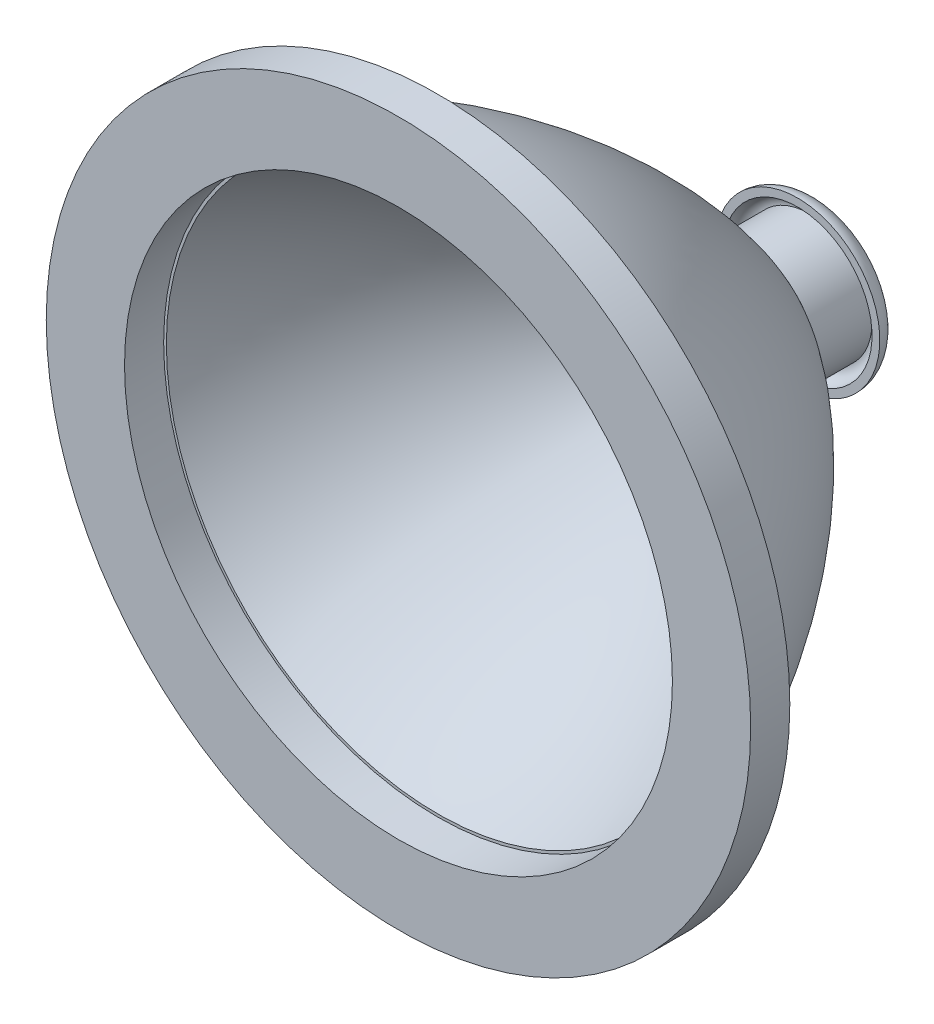
ISO-10303-21;
HEADER;
FILE_DESCRIPTION(('STEP AP214'),'2;1');
FILE_NAME('part.step','',(''),(''),'','','');
FILE_SCHEMA(('AUTOMOTIVE_DESIGN { 1 0 10303 214 1 1 1 1 }'));
ENDSEC;
DATA;
#1=APPLICATION_CONTEXT('core data for automotive mechanical design processes');
#2=APPLICATION_PROTOCOL_DEFINITION('international standard','automotive_design',2000,#1);
#3=PRODUCT_CONTEXT('',#1,'mechanical');
#4=PRODUCT('Part','Part','',(#3));
#5=PRODUCT_RELATED_PRODUCT_CATEGORY('part','',(#4));
#6=PRODUCT_DEFINITION_FORMATION('','',#4);
#7=PRODUCT_DEFINITION_CONTEXT('part definition',#1,'design');
#8=PRODUCT_DEFINITION('design','',#6,#7);
#9=PRODUCT_DEFINITION_SHAPE('','',#8);
#10=(LENGTH_UNIT() NAMED_UNIT(*) SI_UNIT(.MILLI.,.METRE.));
#11=(NAMED_UNIT(*) PLANE_ANGLE_UNIT() SI_UNIT($,.RADIAN.));
#12=(NAMED_UNIT(*) SI_UNIT($,.STERADIAN.) SOLID_ANGLE_UNIT());
#13=UNCERTAINTY_MEASURE_WITH_UNIT(LENGTH_MEASURE(1.E-05),#10,'distance_accuracy_value','');
#14=(GEOMETRIC_REPRESENTATION_CONTEXT(3) GLOBAL_UNCERTAINTY_ASSIGNED_CONTEXT((#13)) GLOBAL_UNIT_ASSIGNED_CONTEXT((#10,
#11,#12)) REPRESENTATION_CONTEXT('',''));
#15=CARTESIAN_POINT('',(0.,0.,0.));
#16=DIRECTION('',(0.,0.,1.));
#17=DIRECTION('',(1.,0.,0.));
#18=AXIS2_PLACEMENT_3D('',#15,#16,#17);
#19=CARTESIAN_POINT('',(0.,0.,0.));
#20=DIRECTION('',(0.,0.,-1.));
#21=DIRECTION('',(-1.,0.,0.));
#22=AXIS2_PLACEMENT_3D('',#19,#20,#21);
#23=PLANE('',#22);
#24=CARTESIAN_POINT('',(0.,0.,0.));
#25=DIRECTION('',(0.,0.,-1.));
#26=DIRECTION('',(-1.,0.,0.));
#27=AXIS2_PLACEMENT_3D('',#24,#25,#26);
#28=CIRCLE('',#27,44.0129431509694);
#29=CARTESIAN_POINT('',(-44.0129431509694,0.,0.));
#30=VERTEX_POINT('',#29);
#31=EDGE_CURVE('E57',#30,#30,#28,.F.);
#32=ORIENTED_EDGE('',*,*,#31,.F.);
#33=EDGE_LOOP('',(#32));
#34=FACE_BOUND('',#33,.T.);
#35=CARTESIAN_POINT('',(0.,0.,0.));
#36=DIRECTION('',(0.,0.,1.));
#37=DIRECTION('',(1.,0.,0.));
#38=AXIS2_PLACEMENT_3D('',#35,#36,#37);
#39=CIRCLE('',#38,44.45);
#40=CARTESIAN_POINT('',(44.45,0.,0.));
#41=VERTEX_POINT('',#40);
#42=EDGE_CURVE('E113',#41,#41,#39,.T.);
#43=ORIENTED_EDGE('',*,*,#42,.T.);
#44=EDGE_LOOP('',(#43));
#45=FACE_BOUND('',#44,.T.);
#46=ADVANCED_FACE('F45',(#34,#45),#23,.F.);
#47=CARTESIAN_POINT('',(0.,0.,-60.96));
#48=DIRECTION('',(0.,0.,1.));
#49=DIRECTION('',(1.,0.,0.));
#50=AXIS2_PLACEMENT_3D('',#47,#48,#49);
#51=CYLINDRICAL_SURFACE('',#50,10.16);
#52=CARTESIAN_POINT('',(0.,0.,-50.8));
#53=DIRECTION('',(0.,0.,-1.));
#54=DIRECTION('',(-1.,0.,0.));
#55=AXIS2_PLACEMENT_3D('',#52,#53,#54);
#56=CIRCLE('',#55,10.16);
#57=CARTESIAN_POINT('',(-10.16,0.,-50.8));
#58=VERTEX_POINT('',#57);
#59=EDGE_CURVE('E68',#58,#58,#56,.T.);
#60=ORIENTED_EDGE('',*,*,#59,.T.);
#61=EDGE_LOOP('',(#60));
#62=FACE_BOUND('',#61,.T.);
#63=CARTESIAN_POINT('',(0.,0.,-60.325));
#64=DIRECTION('',(0.,0.,1.));
#65=DIRECTION('',(1.,0.,0.));
#66=AXIS2_PLACEMENT_3D('',#63,#64,#65);
#67=CIRCLE('',#66,10.16);
#68=CARTESIAN_POINT('',(10.16,0.,-60.325));
#69=VERTEX_POINT('',#68);
#70=EDGE_CURVE('E10',#69,#69,#67,.F.);
#71=ORIENTED_EDGE('',*,*,#70,.F.);
#72=EDGE_LOOP('',(#71));
#73=FACE_BOUND('',#72,.T.);
#74=ADVANCED_FACE('F141',(#62,#73),#51,.T.);
#75=CARTESIAN_POINT('',(0.,0.,34.7283102836008));
#76=DIRECTION('',(0.,0.,1.));
#77=DIRECTION('',(1.,0.,0.));
#78=AXIS2_PLACEMENT_3D('',#75,#76,#77);
#79=DEGENERATE_TOROIDAL_SURFACE('',#78,44.680387854501,101.6,.F.);
#80=CARTESIAN_POINT('',(0.,0.,0.));
#81=DIRECTION('',(0.,0.,1.));
#82=DIRECTION('',(1.,0.,0.));
#83=AXIS2_PLACEMENT_3D('',#80,#81,#82);
#84=CIRCLE('',#83,50.8);
#85=CARTESIAN_POINT('',(50.8,0.,0.));
#86=VERTEX_POINT('',#85);
#87=EDGE_CURVE('E52',#86,#86,#84,.T.);
#88=ORIENTED_EDGE('',*,*,#87,.F.);
#89=EDGE_LOOP('',(#88));
#90=FACE_BOUND('',#89,.T.);
#91=ORIENTED_EDGE('',*,*,#59,.F.);
#92=EDGE_LOOP('',(#91));
#93=FACE_BOUND('',#92,.T.);
#94=ADVANCED_FACE('F147',(#90,#93),#79,.F.);
#95=CARTESIAN_POINT('',(0.,0.,34.7283102836008));
#96=DIRECTION('',(0.,0.,1.));
#97=DIRECTION('',(1.,0.,0.));
#98=AXIS2_PLACEMENT_3D('',#95,#96,#97);
#99=DEGENERATE_TOROIDAL_SURFACE('',#98,44.680387854501,95.25,.F.);
#100=ORIENTED_EDGE('',*,*,#31,.T.);
#101=EDGE_LOOP('',(#100));
#102=FACE_BOUND('',#101,.T.);
#103=CARTESIAN_POINT('',(0.,0.,-44.45));
#104=DIRECTION('',(0.,0.,1.));
#105=DIRECTION('',(1.,0.,0.));
#106=AXIS2_PLACEMENT_3D('',#103,#104,#105);
#107=CIRCLE('',#106,8.26635596071235);
#108=CARTESIAN_POINT('',(8.26635596071235,0.,-44.45));
#109=VERTEX_POINT('',#108);
#110=EDGE_CURVE('E62',#109,#109,#107,.T.);
#111=ORIENTED_EDGE('',*,*,#110,.F.);
#112=EDGE_LOOP('',(#111));
#113=FACE_BOUND('',#112,.T.);
#114=ADVANCED_FACE('F269',(#102,#113),#99,.T.);
#115=CARTESIAN_POINT('',(0.,0.,-44.45));
#116=DIRECTION('',(0.,0.,1.));
#117=DIRECTION('',(1.,0.,0.));
#118=AXIS2_PLACEMENT_3D('',#115,#116,#117);
#119=PLANE('',#118);
#120=CARTESIAN_POINT('',(0.,0.,-44.45));
#121=DIRECTION('',(0.,0.,1.));
#122=DIRECTION('',(1.,0.,0.));
#123=AXIS2_PLACEMENT_3D('',#120,#121,#122);
#124=CIRCLE('',#123,7.61999999999999);
#125=CARTESIAN_POINT('',(7.61999999999999,0.,-44.45));
#126=VERTEX_POINT('',#125);
#127=EDGE_CURVE('E84',#126,#126,#124,.T.);
#128=ORIENTED_EDGE('',*,*,#127,.F.);
#129=EDGE_LOOP('',(#128));
#130=FACE_BOUND('',#129,.T.);
#131=ORIENTED_EDGE('',*,*,#110,.T.);
#132=EDGE_LOOP('',(#131));
#133=FACE_BOUND('',#132,.T.);
#134=ADVANCED_FACE('F259',(#130,#133),#119,.T.);
#135=CARTESIAN_POINT('',(0.,0.,-60.96));
#136=DIRECTION('',(0.,0.,-1.));
#137=DIRECTION('',(-1.,0.,0.));
#138=AXIS2_PLACEMENT_3D('',#135,#136,#137);
#139=PLANE('',#138);
#140=CARTESIAN_POINT('',(0.,0.,-60.96));
#141=DIRECTION('',(0.,0.,1.));
#142=DIRECTION('',(1.,0.,0.));
#143=AXIS2_PLACEMENT_3D('',#140,#141,#142);
#144=CIRCLE('',#143,6.94563);
#145=CARTESIAN_POINT('',(6.94563,0.,-60.96));
#146=VERTEX_POINT('',#145);
#147=EDGE_CURVE('E72',#146,#146,#144,.T.);
#148=ORIENTED_EDGE('',*,*,#147,.T.);
#149=EDGE_LOOP('',(#148));
#150=FACE_BOUND('',#149,.T.);
#151=CARTESIAN_POINT('',(0.,0.,-60.96));
#152=DIRECTION('',(0.,0.,-1.));
#153=DIRECTION('',(-1.,0.,0.));
#154=AXIS2_PLACEMENT_3D('',#151,#152,#153);
#155=CIRCLE('',#154,10.16);
#156=CARTESIAN_POINT('',(-10.16,0.,-60.96));
#157=VERTEX_POINT('',#156);
#158=EDGE_CURVE('E88',#157,#157,#155,.T.);
#159=ORIENTED_EDGE('',*,*,#158,.T.);
#160=EDGE_LOOP('',(#159));
#161=FACE_BOUND('',#160,.T.);
#162=ADVANCED_FACE('F249',(#150,#161),#139,.T.);
#163=CARTESIAN_POINT('',(0.,0.,-44.45));
#164=DIRECTION('',(0.,0.,1.));
#165=DIRECTION('',(1.,0.,0.));
#166=AXIS2_PLACEMENT_3D('',#163,#164,#165);
#167=CYLINDRICAL_SURFACE('',#166,6.94563);
#168=ORIENTED_EDGE('',*,*,#147,.F.);
#169=EDGE_LOOP('',(#168));
#170=FACE_BOUND('',#169,.T.);
#171=CARTESIAN_POINT('',(0.,0.,-49.53));
#172=DIRECTION('',(0.,0.,1.));
#173=DIRECTION('',(1.,0.,0.));
#174=AXIS2_PLACEMENT_3D('',#171,#172,#173);
#175=CIRCLE('',#174,6.94563);
#176=CARTESIAN_POINT('',(6.94563,0.,-49.53));
#177=VERTEX_POINT('',#176);
#178=EDGE_CURVE('E76',#177,#177,#175,.T.);
#179=ORIENTED_EDGE('',*,*,#178,.T.);
#180=EDGE_LOOP('',(#179));
#181=FACE_BOUND('',#180,.T.);
#182=ADVANCED_FACE('F239',(#170,#181),#167,.F.);
#183=CARTESIAN_POINT('',(6.94563,0.,-49.53));
#184=DIRECTION('',(0.,0.,-1.));
#185=DIRECTION('',(-1.,0.,0.));
#186=AXIS2_PLACEMENT_3D('',#183,#184,#185);
#187=PLANE('',#186);
#188=ORIENTED_EDGE('',*,*,#178,.F.);
#189=EDGE_LOOP('',(#188));
#190=FACE_BOUND('',#189,.T.);
#191=CARTESIAN_POINT('',(0.,0.,-49.53));
#192=DIRECTION('',(0.,0.,1.));
#193=DIRECTION('',(1.,0.,0.));
#194=AXIS2_PLACEMENT_3D('',#191,#192,#193);
#195=CIRCLE('',#194,7.62);
#196=CARTESIAN_POINT('',(7.62,0.,-49.53));
#197=VERTEX_POINT('',#196);
#198=EDGE_CURVE('E80',#197,#197,#195,.T.);
#199=ORIENTED_EDGE('',*,*,#198,.T.);
#200=EDGE_LOOP('',(#199));
#201=FACE_BOUND('',#200,.T.);
#202=ADVANCED_FACE('F229',(#190,#201),#187,.F.);
#203=CARTESIAN_POINT('',(0.,0.,-44.45));
#204=DIRECTION('',(0.,0.,1.));
#205=DIRECTION('',(1.,0.,0.));
#206=AXIS2_PLACEMENT_3D('',#203,#204,#205);
#207=CYLINDRICAL_SURFACE('',#206,7.61999999999999);
#208=ORIENTED_EDGE('',*,*,#198,.F.);
#209=EDGE_LOOP('',(#208));
#210=FACE_BOUND('',#209,.T.);
#211=ORIENTED_EDGE('',*,*,#127,.T.);
#212=EDGE_LOOP('',(#211));
#213=FACE_BOUND('',#212,.T.);
#214=ADVANCED_FACE('F214',(#210,#213),#207,.F.);
#215=CARTESIAN_POINT('',(0.,0.,-58.42));
#216=DIRECTION('',(0.,0.,-1.));
#217=DIRECTION('',(-1.,0.,0.));
#218=AXIS2_PLACEMENT_3D('',#215,#216,#217);
#219=TOROIDAL_SURFACE('',#218,10.16,3.175);
#220=CARTESIAN_POINT('',(0.,0.,-58.42));
#221=DIRECTION('',(0.,0.,-1.));
#222=DIRECTION('',(-1.,0.,0.));
#223=AXIS2_PLACEMENT_3D('',#220,#221,#222);
#224=CIRCLE('',#223,13.335);
#225=CARTESIAN_POINT('',(-13.335,0.,-58.42));
#226=VERTEX_POINT('',#225);
#227=EDGE_CURVE('E92',#226,#226,#224,.T.);
#228=ORIENTED_EDGE('',*,*,#227,.T.);
#229=EDGE_LOOP('',(#228));
#230=FACE_BOUND('',#229,.T.);
#231=CARTESIAN_POINT('',(0.,0.,-61.595));
#232=DIRECTION('',(0.,0.,-1.));
#233=DIRECTION('',(-1.,0.,0.));
#234=AXIS2_PLACEMENT_3D('',#231,#232,#233);
#235=CIRCLE('',#234,10.16);
#236=CARTESIAN_POINT('',(-10.16,0.,-61.595));
#237=VERTEX_POINT('',#236);
#238=EDGE_CURVE('E100',#237,#237,#235,.T.);
#239=ORIENTED_EDGE('',*,*,#238,.F.);
#240=EDGE_LOOP('',(#239));
#241=FACE_BOUND('',#240,.T.);
#242=ADVANCED_FACE('F204',(#230,#241),#219,.T.);
#243=CARTESIAN_POINT('',(0.,12.065,-58.42));
#244=DIRECTION('',(0.,0.,-1.));
#245=DIRECTION('',(-1.,0.,0.));
#246=AXIS2_PLACEMENT_3D('',#243,#244,#245);
#247=PLANE('',#246);
#248=ORIENTED_EDGE('',*,*,#227,.F.);
#249=EDGE_LOOP('',(#248));
#250=FACE_BOUND('',#249,.T.);
#251=CARTESIAN_POINT('',(0.,0.,-58.42));
#252=DIRECTION('',(0.,0.,-1.));
#253=DIRECTION('',(-1.,0.,0.));
#254=AXIS2_PLACEMENT_3D('',#251,#252,#253);
#255=CIRCLE('',#254,12.065);
#256=CARTESIAN_POINT('',(-12.065,0.,-58.42));
#257=VERTEX_POINT('',#256);
#258=EDGE_CURVE('E96',#257,#257,#255,.T.);
#259=ORIENTED_EDGE('',*,*,#258,.T.);
#260=EDGE_LOOP('',(#259));
#261=FACE_BOUND('',#260,.T.);
#262=ADVANCED_FACE('F194',(#250,#261),#247,.F.);
#263=CARTESIAN_POINT('',(0.,0.,-58.42));
#264=DIRECTION('',(0.,0.,-1.));
#265=DIRECTION('',(-1.,0.,0.));
#266=AXIS2_PLACEMENT_3D('',#263,#264,#265);
#267=TOROIDAL_SURFACE('',#266,10.16,1.905);
#268=ORIENTED_EDGE('',*,*,#258,.F.);
#269=EDGE_LOOP('',(#268));
#270=FACE_BOUND('',#269,.T.);
#271=ORIENTED_EDGE('',*,*,#70,.T.);
#272=EDGE_LOOP('',(#271));
#273=FACE_BOUND('',#272,.T.);
#274=ADVANCED_FACE('F184',(#270,#273),#267,.F.);
#275=CARTESIAN_POINT('',(0.,0.,-55.88));
#276=DIRECTION('',(0.,0.,-1.));
#277=DIRECTION('',(-1.,0.,0.));
#278=AXIS2_PLACEMENT_3D('',#275,#276,#277);
#279=CYLINDRICAL_SURFACE('',#278,10.16);
#280=ORIENTED_EDGE('',*,*,#158,.F.);
#281=EDGE_LOOP('',(#280));
#282=FACE_BOUND('',#281,.T.);
#283=ORIENTED_EDGE('',*,*,#238,.T.);
#284=EDGE_LOOP('',(#283));
#285=FACE_BOUND('',#284,.T.);
#286=ADVANCED_FACE('F136',(#282,#285),#279,.F.);
#287=CARTESIAN_POINT('',(0.,0.,0.));
#288=DIRECTION('',(0.,0.,1.));
#289=DIRECTION('',(1.,0.,0.));
#290=AXIS2_PLACEMENT_3D('',#287,#288,#289);
#291=PLANE('',#290);
#292=CARTESIAN_POINT('',(0.,0.,0.));
#293=DIRECTION('',(0.,0.,1.));
#294=DIRECTION('',(1.,0.,0.));
#295=AXIS2_PLACEMENT_3D('',#292,#293,#294);
#296=CIRCLE('',#295,57.15);
#297=CARTESIAN_POINT('',(57.15,0.,0.));
#298=VERTEX_POINT('',#297);
#299=EDGE_CURVE('E105',#298,#298,#296,.T.);
#300=ORIENTED_EDGE('',*,*,#299,.F.);
#301=EDGE_LOOP('',(#300));
#302=FACE_BOUND('',#301,.T.);
#303=ORIENTED_EDGE('',*,*,#87,.T.);
#304=EDGE_LOOP('',(#303));
#305=FACE_BOUND('',#304,.T.);
#306=ADVANCED_FACE('F127',(#302,#305),#291,.F.);
#307=CARTESIAN_POINT('',(0.,0.,6.35));
#308=DIRECTION('',(0.,0.,1.));
#309=DIRECTION('',(1.,0.,0.));
#310=AXIS2_PLACEMENT_3D('',#307,#308,#309);
#311=PLANE('',#310);
#312=CARTESIAN_POINT('',(0.,0.,6.35));
#313=DIRECTION('',(0.,0.,1.));
#314=DIRECTION('',(1.,0.,0.));
#315=AXIS2_PLACEMENT_3D('',#312,#313,#314);
#316=CIRCLE('',#315,57.15);
#317=CARTESIAN_POINT('',(57.15,0.,6.35));
#318=VERTEX_POINT('',#317);
#319=EDGE_CURVE('E104',#318,#318,#316,.T.);
#320=ORIENTED_EDGE('',*,*,#319,.T.);
#321=EDGE_LOOP('',(#320));
#322=FACE_BOUND('',#321,.T.);
#323=CARTESIAN_POINT('',(0.,0.,6.35));
#324=DIRECTION('',(0.,0.,1.));
#325=DIRECTION('',(1.,0.,0.));
#326=AXIS2_PLACEMENT_3D('',#323,#324,#325);
#327=CIRCLE('',#326,44.45);
#328=CARTESIAN_POINT('',(44.45,0.,6.35));
#329=VERTEX_POINT('',#328);
#330=EDGE_CURVE('E109',#329,#329,#327,.T.);
#331=ORIENTED_EDGE('',*,*,#330,.F.);
#332=EDGE_LOOP('',(#331));
#333=FACE_BOUND('',#332,.T.);
#334=ADVANCED_FACE('F124',(#322,#333),#311,.T.);
#335=CARTESIAN_POINT('',(0.,0.,6.35));
#336=DIRECTION('',(0.,0.,-1.));
#337=DIRECTION('',(-1.,0.,0.));
#338=AXIS2_PLACEMENT_3D('',#335,#336,#337);
#339=CYLINDRICAL_SURFACE('',#338,57.15);
#340=ORIENTED_EDGE('',*,*,#319,.F.);
#341=EDGE_LOOP('',(#340));
#342=FACE_BOUND('',#341,.T.);
#343=ORIENTED_EDGE('',*,*,#299,.T.);
#344=EDGE_LOOP('',(#343));
#345=FACE_BOUND('',#344,.T.);
#346=ADVANCED_FACE('F126',(#342,#345),#339,.T.);
#347=CARTESIAN_POINT('',(0.,0.,6.35));
#348=DIRECTION('',(0.,0.,-1.));
#349=DIRECTION('',(-1.,0.,0.));
#350=AXIS2_PLACEMENT_3D('',#347,#348,#349);
#351=CYLINDRICAL_SURFACE('',#350,44.45);
#352=ORIENTED_EDGE('',*,*,#330,.T.);
#353=EDGE_LOOP('',(#352));
#354=FACE_BOUND('',#353,.T.);
#355=ORIENTED_EDGE('',*,*,#42,.F.);
#356=EDGE_LOOP('',(#355));
#357=FACE_BOUND('',#356,.T.);
#358=ADVANCED_FACE('F121',(#354,#357),#351,.F.);
#359=CLOSED_SHELL('',(#46,#74,#94,#114,#134,#162,#182,#202,#214,#242,#262,#274,#286,#306,#334,
#346,#358));
#360=MANIFOLD_SOLID_BREP('B2',#359);
#361=ADVANCED_BREP_SHAPE_REPRESENTATION('',(#18,#360),#14);
#362=SHAPE_DEFINITION_REPRESENTATION(#9,#361);
ENDSEC;
END-ISO-10303-21;
